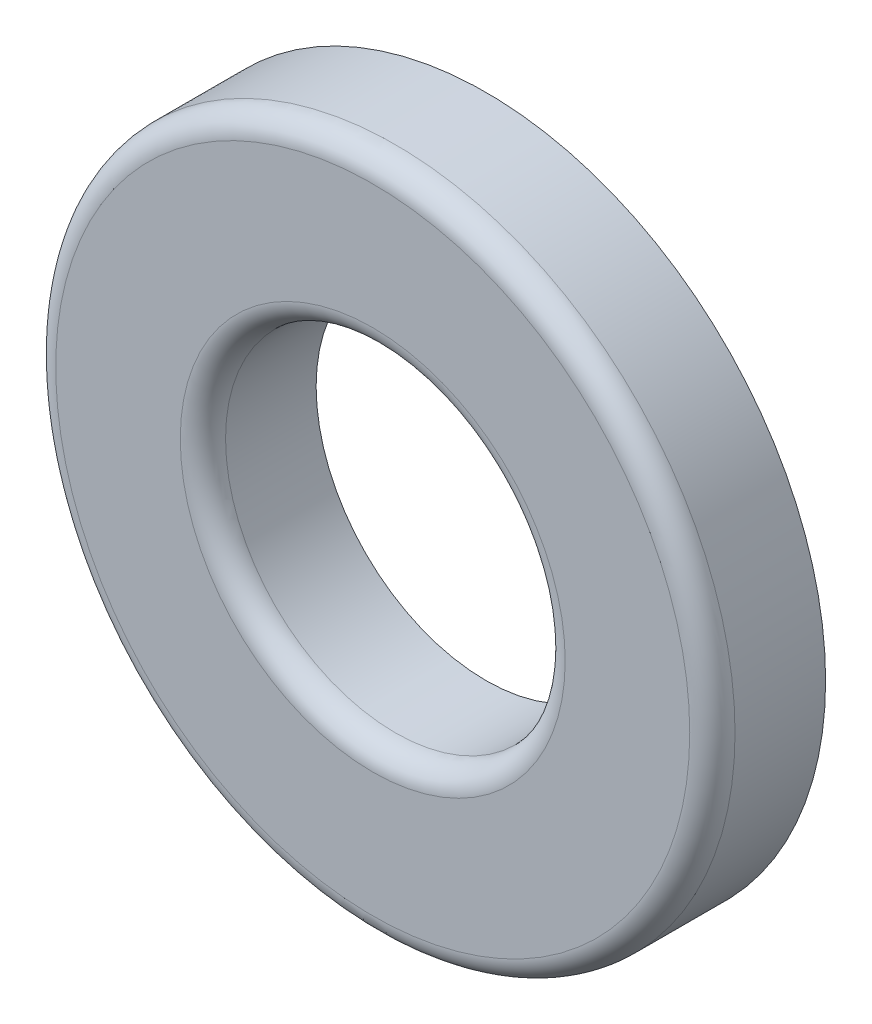
ISO-10303-21;
HEADER;
FILE_DESCRIPTION(('STEP AP214'),'2;1');
FILE_NAME('part.step','',(''),(''),'','','');
FILE_SCHEMA(('AUTOMOTIVE_DESIGN { 1 0 10303 214 1 1 1 1 }'));
ENDSEC;
DATA;
#1=APPLICATION_CONTEXT('core data for automotive mechanical design processes');
#2=APPLICATION_PROTOCOL_DEFINITION('international standard','automotive_design',2000,#1);
#3=PRODUCT_CONTEXT('',#1,'mechanical');
#4=PRODUCT('Part','Part','',(#3));
#5=PRODUCT_RELATED_PRODUCT_CATEGORY('part','',(#4));
#6=PRODUCT_DEFINITION_FORMATION('','',#4);
#7=PRODUCT_DEFINITION_CONTEXT('part definition',#1,'design');
#8=PRODUCT_DEFINITION('design','',#6,#7);
#9=PRODUCT_DEFINITION_SHAPE('','',#8);
#10=(LENGTH_UNIT() NAMED_UNIT(*) SI_UNIT(.MILLI.,.METRE.));
#11=(NAMED_UNIT(*) PLANE_ANGLE_UNIT() SI_UNIT($,.RADIAN.));
#12=(NAMED_UNIT(*) SI_UNIT($,.STERADIAN.) SOLID_ANGLE_UNIT());
#13=UNCERTAINTY_MEASURE_WITH_UNIT(LENGTH_MEASURE(1.E-05),#10,'distance_accuracy_value','');
#14=(GEOMETRIC_REPRESENTATION_CONTEXT(3) GLOBAL_UNCERTAINTY_ASSIGNED_CONTEXT((#13)) GLOBAL_UNIT_ASSIGNED_CONTEXT((#10,
#11,#12)) REPRESENTATION_CONTEXT('',''));
#15=CARTESIAN_POINT('',(0.,0.,0.));
#16=DIRECTION('',(0.,0.,1.));
#17=DIRECTION('',(1.,0.,0.));
#18=AXIS2_PLACEMENT_3D('',#15,#16,#17);
#19=CARTESIAN_POINT('',(0.,0.,10.));
#20=DIRECTION('',(0.,0.,1.));
#21=DIRECTION('',(1.,0.,0.));
#22=AXIS2_PLACEMENT_3D('',#19,#20,#21);
#23=PLANE('',#22);
#24=CARTESIAN_POINT('',(0.,0.,10.));
#25=DIRECTION('',(0.,0.,1.));
#26=DIRECTION('',(1.,0.,0.));
#27=AXIS2_PLACEMENT_3D('',#24,#25,#26);
#28=CIRCLE('',#27,17.);
#29=CARTESIAN_POINT('',(17.,0.,10.));
#30=VERTEX_POINT('',#29);
#31=EDGE_CURVE('E49',#30,#30,#28,.F.);
#32=ORIENTED_EDGE('',*,*,#31,.T.);
#33=EDGE_LOOP('',(#32));
#34=FACE_BOUND('',#33,.T.);
#35=CARTESIAN_POINT('',(0.,0.,10.));
#36=DIRECTION('',(0.,0.,1.));
#37=DIRECTION('',(1.,0.,0.));
#38=AXIS2_PLACEMENT_3D('',#35,#36,#37);
#39=CIRCLE('',#38,28.);
#40=CARTESIAN_POINT('',(28.,0.,10.));
#41=VERTEX_POINT('',#40);
#42=EDGE_CURVE('E53',#41,#41,#39,.T.);
#43=ORIENTED_EDGE('',*,*,#42,.T.);
#44=EDGE_LOOP('',(#43));
#45=FACE_BOUND('',#44,.T.);
#46=ADVANCED_FACE('F42',(#34,#45),#23,.T.);
#47=CARTESIAN_POINT('',(0.,0.,0.));
#48=DIRECTION('',(0.,0.,1.));
#49=DIRECTION('',(1.,0.,0.));
#50=AXIS2_PLACEMENT_3D('',#47,#48,#49);
#51=PLANE('',#50);
#52=CARTESIAN_POINT('',(0.,0.,0.));
#53=DIRECTION('',(0.,0.,1.));
#54=DIRECTION('',(1.,0.,0.));
#55=AXIS2_PLACEMENT_3D('',#52,#53,#54);
#56=CIRCLE('',#55,30.);
#57=CARTESIAN_POINT('',(30.,0.,0.));
#58=VERTEX_POINT('',#57);
#59=EDGE_CURVE('E62',#58,#58,#56,.T.);
#60=ORIENTED_EDGE('',*,*,#59,.F.);
#61=EDGE_LOOP('',(#60));
#62=FACE_BOUND('',#61,.T.);
#63=CARTESIAN_POINT('',(0.,0.,0.));
#64=DIRECTION('',(0.,0.,1.));
#65=DIRECTION('',(1.,0.,0.));
#66=AXIS2_PLACEMENT_3D('',#63,#64,#65);
#67=CIRCLE('',#66,15.);
#68=CARTESIAN_POINT('',(15.,0.,0.));
#69=VERTEX_POINT('',#68);
#70=EDGE_CURVE('E65',#69,#69,#67,.T.);
#71=ORIENTED_EDGE('',*,*,#70,.T.);
#72=EDGE_LOOP('',(#71));
#73=FACE_BOUND('',#72,.T.);
#74=ADVANCED_FACE('F69',(#62,#73),#51,.F.);
#75=CARTESIAN_POINT('',(0.,0.,10.));
#76=DIRECTION('',(0.,0.,-1.));
#77=DIRECTION('',(-1.,0.,0.));
#78=AXIS2_PLACEMENT_3D('',#75,#76,#77);
#79=CYLINDRICAL_SURFACE('',#78,30.);
#80=CARTESIAN_POINT('',(0.,0.,8.));
#81=DIRECTION('',(0.,0.,1.));
#82=DIRECTION('',(1.,0.,0.));
#83=AXIS2_PLACEMENT_3D('',#80,#81,#82);
#84=CIRCLE('',#83,30.);
#85=CARTESIAN_POINT('',(30.,0.,8.));
#86=VERTEX_POINT('',#85);
#87=EDGE_CURVE('E11',#86,#86,#84,.F.);
#88=ORIENTED_EDGE('',*,*,#87,.T.);
#89=EDGE_LOOP('',(#88));
#90=FACE_BOUND('',#89,.T.);
#91=ORIENTED_EDGE('',*,*,#59,.T.);
#92=EDGE_LOOP('',(#91));
#93=FACE_BOUND('',#92,.T.);
#94=ADVANCED_FACE('F74',(#90,#93),#79,.T.);
#95=CARTESIAN_POINT('',(0.,0.,10.));
#96=DIRECTION('',(0.,0.,-1.));
#97=DIRECTION('',(-1.,0.,0.));
#98=AXIS2_PLACEMENT_3D('',#95,#96,#97);
#99=CYLINDRICAL_SURFACE('',#98,15.);
#100=CARTESIAN_POINT('',(0.,0.,8.));
#101=DIRECTION('',(0.,0.,1.));
#102=DIRECTION('',(1.,0.,0.));
#103=AXIS2_PLACEMENT_3D('',#100,#101,#102);
#104=CIRCLE('',#103,15.);
#105=CARTESIAN_POINT('',(15.,0.,8.));
#106=VERTEX_POINT('',#105);
#107=EDGE_CURVE('E57',#106,#106,#104,.T.);
#108=ORIENTED_EDGE('',*,*,#107,.T.);
#109=EDGE_LOOP('',(#108));
#110=FACE_BOUND('',#109,.T.);
#111=ORIENTED_EDGE('',*,*,#70,.F.);
#112=EDGE_LOOP('',(#111));
#113=FACE_BOUND('',#112,.T.);
#114=ADVANCED_FACE('F71',(#110,#113),#99,.F.);
#115=CARTESIAN_POINT('',(0.,0.,8.));
#116=DIRECTION('',(0.,0.,1.));
#117=DIRECTION('',(1.,0.,0.));
#118=AXIS2_PLACEMENT_3D('',#115,#116,#117);
#119=TOROIDAL_SURFACE('',#118,17.,2.);
#120=ORIENTED_EDGE('',*,*,#31,.F.);
#121=EDGE_LOOP('',(#120));
#122=FACE_BOUND('',#121,.T.);
#123=ORIENTED_EDGE('',*,*,#107,.F.);
#124=EDGE_LOOP('',(#123));
#125=FACE_BOUND('',#124,.T.);
#126=ADVANCED_FACE('F73',(#122,#125),#119,.T.);
#127=CARTESIAN_POINT('',(0.,0.,8.));
#128=DIRECTION('',(0.,0.,1.));
#129=DIRECTION('',(1.,0.,0.));
#130=AXIS2_PLACEMENT_3D('',#127,#128,#129);
#131=TOROIDAL_SURFACE('',#130,28.,2.);
#132=ORIENTED_EDGE('',*,*,#87,.F.);
#133=EDGE_LOOP('',(#132));
#134=FACE_BOUND('',#133,.T.);
#135=ORIENTED_EDGE('',*,*,#42,.F.);
#136=EDGE_LOOP('',(#135));
#137=FACE_BOUND('',#136,.T.);
#138=ADVANCED_FACE('F44',(#134,#137),#131,.T.);
#139=CLOSED_SHELL('',(#46,#74,#94,#114,#126,#138));
#140=MANIFOLD_SOLID_BREP('B2',#139);
#141=ADVANCED_BREP_SHAPE_REPRESENTATION('',(#18,#140),#14);
#142=SHAPE_DEFINITION_REPRESENTATION(#9,#141);
ENDSEC;
END-ISO-10303-21;
